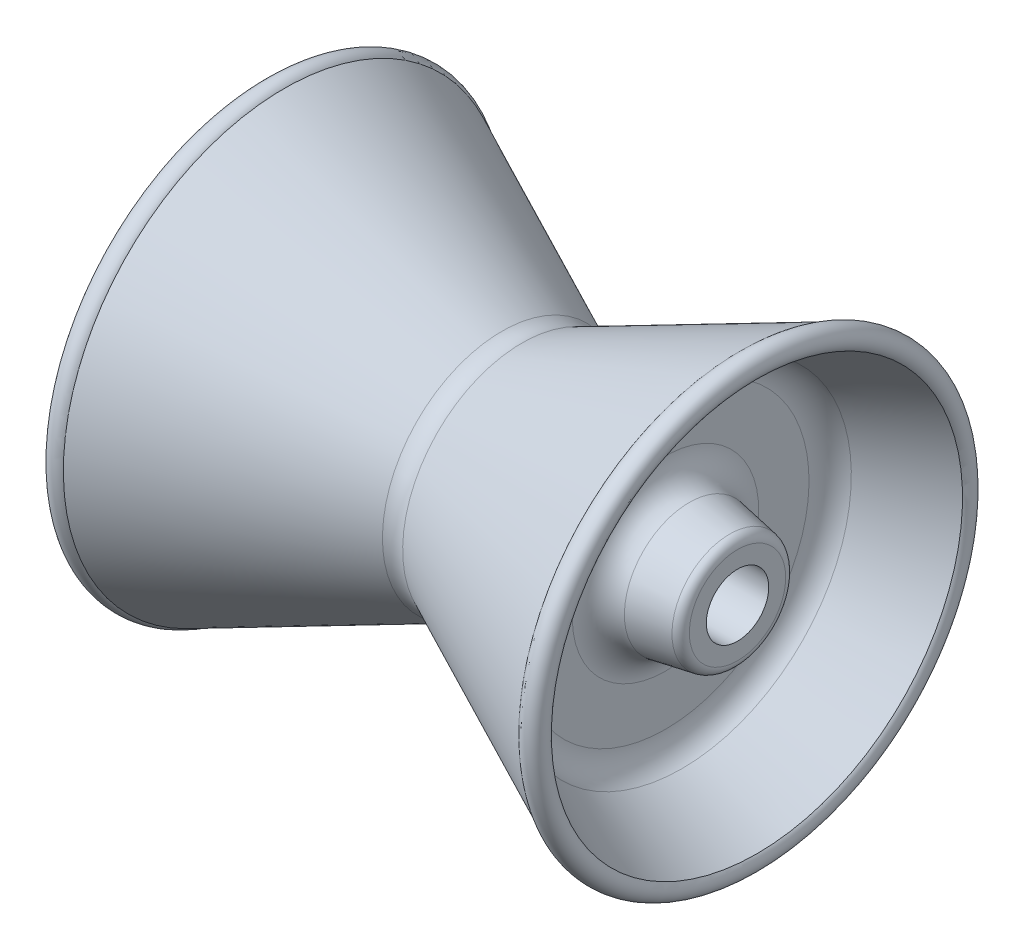
ISO-10303-21;
HEADER;
FILE_DESCRIPTION(('STEP AP214'),'2;1');
FILE_NAME('part.step','',(''),(''),'','','');
FILE_SCHEMA(('AUTOMOTIVE_DESIGN { 1 0 10303 214 1 1 1 1 }'));
ENDSEC;
DATA;
#1=APPLICATION_CONTEXT('core data for automotive mechanical design processes');
#2=APPLICATION_PROTOCOL_DEFINITION('international standard','automotive_design',2000,#1);
#3=PRODUCT_CONTEXT('',#1,'mechanical');
#4=PRODUCT('Part','Part','',(#3));
#5=PRODUCT_RELATED_PRODUCT_CATEGORY('part','',(#4));
#6=PRODUCT_DEFINITION_FORMATION('','',#4);
#7=PRODUCT_DEFINITION_CONTEXT('part definition',#1,'design');
#8=PRODUCT_DEFINITION('design','',#6,#7);
#9=PRODUCT_DEFINITION_SHAPE('','',#8);
#10=(LENGTH_UNIT() NAMED_UNIT(*) SI_UNIT(.MILLI.,.METRE.));
#11=(NAMED_UNIT(*) PLANE_ANGLE_UNIT() SI_UNIT($,.RADIAN.));
#12=(NAMED_UNIT(*) SI_UNIT($,.STERADIAN.) SOLID_ANGLE_UNIT());
#13=UNCERTAINTY_MEASURE_WITH_UNIT(LENGTH_MEASURE(1.E-05),#10,'distance_accuracy_value','');
#14=(GEOMETRIC_REPRESENTATION_CONTEXT(3) GLOBAL_UNCERTAINTY_ASSIGNED_CONTEXT((#13)) GLOBAL_UNIT_ASSIGNED_CONTEXT((#10,
#11,#12)) REPRESENTATION_CONTEXT('',''));
#15=CARTESIAN_POINT('',(0.,0.,0.));
#16=DIRECTION('',(0.,0.,1.));
#17=DIRECTION('',(1.,0.,0.));
#18=AXIS2_PLACEMENT_3D('',#15,#16,#17);
#19=CARTESIAN_POINT('',(-100.,0.,0.));
#20=DIRECTION('',(-1.,0.,0.));
#21=DIRECTION('',(0.,-1.,0.));
#22=AXIS2_PLACEMENT_3D('',#19,#20,#21);
#23=TOROIDAL_SURFACE('',#22,106.313960308022,30.);
#24=CARTESIAN_POINT('',(-87.0115930793771,0.,0.));
#25=DIRECTION('',(-1.,0.,0.));
#26=DIRECTION('',(0.,-1.,0.));
#27=AXIS2_PLACEMENT_3D('',#24,#25,#26);
#28=CIRCLE('',#27,133.356543129644);
#29=CARTESIAN_POINT('',(-87.0115930793771,-133.356543129644,0.));
#30=VERTEX_POINT('',#29);
#31=EDGE_CURVE('E10',#30,#30,#28,.T.);
#32=ORIENTED_EDGE('',*,*,#31,.F.);
#33=EDGE_LOOP('',(#32));
#34=FACE_BOUND('',#33,.T.);
#35=CARTESIAN_POINT('',(-130.,0.,0.));
#36=DIRECTION('',(-1.,0.,0.));
#37=DIRECTION('',(0.,-1.,0.));
#38=AXIS2_PLACEMENT_3D('',#35,#36,#37);
#39=CIRCLE('',#38,106.313960308022);
#40=CARTESIAN_POINT('',(-130.,-106.313960308022,0.));
#41=VERTEX_POINT('',#40);
#42=EDGE_CURVE('E123',#41,#41,#39,.T.);
#43=ORIENTED_EDGE('',*,*,#42,.T.);
#44=EDGE_LOOP('',(#43));
#45=FACE_BOUND('',#44,.T.);
#46=ADVANCED_FACE('F35',(#34,#45),#23,.F.);
#47=CARTESIAN_POINT('',(-87.0115930793771,0.,0.));
#48=DIRECTION('',(-1.,0.,0.));
#49=DIRECTION('',(0.,-1.,0.));
#50=AXIS2_PLACEMENT_3D('',#47,#48,#49);
#51=CONICAL_SURFACE('',#50,133.356543129644,0.447759394628515);
#52=CARTESIAN_POINT('',(-21.6473448677048,0.,0.));
#53=DIRECTION('',(-1.,0.,0.));
#54=DIRECTION('',(0.,-1.,0.));
#55=AXIS2_PLACEMENT_3D('',#52,#53,#54);
#56=CIRCLE('',#55,101.962446662092);
#57=CARTESIAN_POINT('',(-21.6473448677048,-101.962446662092,0.));
#58=VERTEX_POINT('',#57);
#59=EDGE_CURVE('E41',#58,#58,#56,.T.);
#60=ORIENTED_EDGE('',*,*,#59,.F.);
#61=EDGE_LOOP('',(#60));
#62=FACE_BOUND('',#61,.T.);
#63=ORIENTED_EDGE('',*,*,#31,.T.);
#64=EDGE_LOOP('',(#63));
#65=FACE_BOUND('',#64,.T.);
#66=ADVANCED_FACE('F280',(#62,#65),#51,.F.);
#67=CARTESIAN_POINT('',(0.,0.,0.));
#68=DIRECTION('',(-1.,0.,0.));
#69=DIRECTION('',(0.,-1.,0.));
#70=AXIS2_PLACEMENT_3D('',#67,#68,#69);
#71=TOROIDAL_SURFACE('',#70,147.033418031463,50.);
#72=CARTESIAN_POINT('',(21.6473448677048,0.,0.));
#73=DIRECTION('',(-1.,0.,0.));
#74=DIRECTION('',(0.,-1.,0.));
#75=AXIS2_PLACEMENT_3D('',#72,#73,#74);
#76=CIRCLE('',#75,101.962446662092);
#77=CARTESIAN_POINT('',(21.6473448677049,-101.962446662092,0.));
#78=VERTEX_POINT('',#77);
#79=EDGE_CURVE('E45',#78,#78,#76,.T.);
#80=ORIENTED_EDGE('',*,*,#79,.F.);
#81=EDGE_LOOP('',(#80));
#82=FACE_BOUND('',#81,.T.);
#83=ORIENTED_EDGE('',*,*,#59,.T.);
#84=EDGE_LOOP('',(#83));
#85=FACE_BOUND('',#84,.T.);
#86=ADVANCED_FACE('F275',(#82,#85),#71,.T.);
#87=CARTESIAN_POINT('',(21.6473448677048,0.,0.));
#88=DIRECTION('',(1.,0.,0.));
#89=DIRECTION('',(0.,1.,0.));
#90=AXIS2_PLACEMENT_3D('',#87,#88,#89);
#91=CONICAL_SURFACE('',#90,101.962446662092,0.447759394628514);
#92=CARTESIAN_POINT('',(87.0115930793771,0.,0.));
#93=DIRECTION('',(-1.,0.,0.));
#94=DIRECTION('',(0.,-1.,0.));
#95=AXIS2_PLACEMENT_3D('',#92,#93,#94);
#96=CIRCLE('',#95,133.356543129644);
#97=CARTESIAN_POINT('',(87.0115930793771,-133.356543129644,0.));
#98=VERTEX_POINT('',#97);
#99=EDGE_CURVE('E49',#98,#98,#96,.T.);
#100=ORIENTED_EDGE('',*,*,#99,.F.);
#101=EDGE_LOOP('',(#100));
#102=FACE_BOUND('',#101,.T.);
#103=ORIENTED_EDGE('',*,*,#79,.T.);
#104=EDGE_LOOP('',(#103));
#105=FACE_BOUND('',#104,.T.);
#106=ADVANCED_FACE('F269',(#102,#105),#91,.F.);
#107=CARTESIAN_POINT('',(100.,0.,0.));
#108=DIRECTION('',(-1.,0.,0.));
#109=DIRECTION('',(0.,-1.,0.));
#110=AXIS2_PLACEMENT_3D('',#107,#108,#109);
#111=TOROIDAL_SURFACE('',#110,106.313960308022,30.);
#112=CARTESIAN_POINT('',(130.,0.,0.));
#113=DIRECTION('',(-1.,0.,0.));
#114=DIRECTION('',(0.,-1.,0.));
#115=AXIS2_PLACEMENT_3D('',#112,#113,#114);
#116=CIRCLE('',#115,106.313960308022);
#117=CARTESIAN_POINT('',(130.,-106.313960308022,0.));
#118=VERTEX_POINT('',#117);
#119=EDGE_CURVE('E54',#118,#118,#116,.T.);
#120=ORIENTED_EDGE('',*,*,#119,.F.);
#121=EDGE_LOOP('',(#120));
#122=FACE_BOUND('',#121,.T.);
#123=ORIENTED_EDGE('',*,*,#99,.T.);
#124=EDGE_LOOP('',(#123));
#125=FACE_BOUND('',#124,.T.);
#126=ADVANCED_FACE('F263',(#122,#125),#111,.F.);
#127=CARTESIAN_POINT('',(130.,32.5,0.));
#128=DIRECTION('',(1.,0.,0.));
#129=DIRECTION('',(0.,1.,0.));
#130=AXIS2_PLACEMENT_3D('',#127,#128,#129);
#131=PLANE('',#130);
#132=CARTESIAN_POINT('',(130.,0.,0.));
#133=DIRECTION('',(-1.,0.,0.));
#134=DIRECTION('',(0.,-1.,0.));
#135=AXIS2_PLACEMENT_3D('',#132,#133,#134);
#136=CIRCLE('',#135,32.5);
#137=CARTESIAN_POINT('',(130.,-32.4999999999999,0.));
#138=VERTEX_POINT('',#137);
#139=EDGE_CURVE('E57',#138,#138,#136,.T.);
#140=ORIENTED_EDGE('',*,*,#139,.F.);
#141=EDGE_LOOP('',(#140));
#142=FACE_BOUND('',#141,.T.);
#143=ORIENTED_EDGE('',*,*,#119,.T.);
#144=EDGE_LOOP('',(#143));
#145=FACE_BOUND('',#144,.T.);
#146=ADVANCED_FACE('F257',(#142,#145),#131,.F.);
#147=CARTESIAN_POINT('',(-235.,0.,0.));
#148=DIRECTION('',(-1.,0.,0.));
#149=DIRECTION('',(0.,-1.,0.));
#150=AXIS2_PLACEMENT_3D('',#147,#148,#149);
#151=CYLINDRICAL_SURFACE('',#150,32.4999999999999);
#152=CARTESIAN_POINT('',(234.789217646546,0.,0.));
#153=DIRECTION('',(-1.,0.,0.));
#154=DIRECTION('',(0.,-1.,0.));
#155=AXIS2_PLACEMENT_3D('',#152,#153,#154);
#156=CIRCLE('',#155,32.4999999999999);
#157=CARTESIAN_POINT('',(234.789217646546,-32.4999999999998,0.));
#158=VERTEX_POINT('',#157);
#159=EDGE_CURVE('E60',#158,#158,#156,.T.);
#160=ORIENTED_EDGE('',*,*,#159,.F.);
#161=EDGE_LOOP('',(#160));
#162=FACE_BOUND('',#161,.T.);
#163=ORIENTED_EDGE('',*,*,#139,.T.);
#164=EDGE_LOOP('',(#163));
#165=FACE_BOUND('',#164,.T.);
#166=ADVANCED_FACE('F251',(#162,#165),#151,.F.);
#167=CARTESIAN_POINT('',(234.789217646546,32.5,0.));
#168=DIRECTION('',(-1.,0.,0.));
#169=DIRECTION('',(0.,-1.,0.));
#170=AXIS2_PLACEMENT_3D('',#167,#168,#169);
#171=PLANE('',#170);
#172=CARTESIAN_POINT('',(234.789217646546,0.,0.));
#173=DIRECTION('',(-1.,0.,0.));
#174=DIRECTION('',(0.,-1.,0.));
#175=AXIS2_PLACEMENT_3D('',#172,#173,#174);
#176=CIRCLE('',#175,50.1555273228456);
#177=CARTESIAN_POINT('',(234.789217646546,-50.1555273228456,0.));
#178=VERTEX_POINT('',#177);
#179=EDGE_CURVE('E63',#178,#178,#176,.T.);
#180=ORIENTED_EDGE('',*,*,#179,.F.);
#181=EDGE_LOOP('',(#180));
#182=FACE_BOUND('',#181,.T.);
#183=ORIENTED_EDGE('',*,*,#159,.T.);
#184=EDGE_LOOP('',(#183));
#185=FACE_BOUND('',#184,.T.);
#186=ADVANCED_FACE('F245',(#182,#185),#171,.F.);
#187=CARTESIAN_POINT('',(224.789217646546,0.,0.));
#188=DIRECTION('',(-1.,0.,0.));
#189=DIRECTION('',(0.,-1.,0.));
#190=AXIS2_PLACEMENT_3D('',#187,#188,#189);
#191=TOROIDAL_SURFACE('',#190,50.1555273228456,9.99999999999999);
#192=CARTESIAN_POINT('',(226.546020910649,0.,0.));
#193=DIRECTION('',(-1.,0.,0.));
#194=DIRECTION('',(0.,-1.,0.));
#195=AXIS2_PLACEMENT_3D('',#192,#193,#194);
#196=CIRCLE('',#195,59.9999999999999);
#197=CARTESIAN_POINT('',(226.546020910649,-59.9999999999998,0.));
#198=VERTEX_POINT('',#197);
#199=EDGE_CURVE('E66',#198,#198,#196,.T.);
#200=ORIENTED_EDGE('',*,*,#199,.F.);
#201=EDGE_LOOP('',(#200));
#202=FACE_BOUND('',#201,.T.);
#203=ORIENTED_EDGE('',*,*,#179,.T.);
#204=EDGE_LOOP('',(#203));
#205=FACE_BOUND('',#204,.T.);
#206=ADVANCED_FACE('F239',(#202,#205),#191,.T.);
#207=CARTESIAN_POINT('',(226.546020910649,0.,0.));
#208=DIRECTION('',(-1.,0.,0.));
#209=DIRECTION('',(0.,-1.,0.));
#210=AXIS2_PLACEMENT_3D('',#207,#208,#209);
#211=CONICAL_SURFACE('',#210,59.9999999999999,0.176596800117247);
#212=CARTESIAN_POINT('',(184.518807854237,0.,0.));
#213=DIRECTION('',(-1.,0.,0.));
#214=DIRECTION('',(0.,-1.,0.));
#215=AXIS2_PLACEMENT_3D('',#212,#213,#214);
#216=CIRCLE('',#215,67.4999999999999);
#217=CARTESIAN_POINT('',(184.518807854237,-67.4999999999998,0.));
#218=VERTEX_POINT('',#217);
#219=EDGE_CURVE('E69',#218,#218,#216,.T.);
#220=ORIENTED_EDGE('',*,*,#219,.F.);
#221=EDGE_LOOP('',(#220));
#222=FACE_BOUND('',#221,.T.);
#223=ORIENTED_EDGE('',*,*,#199,.T.);
#224=EDGE_LOOP('',(#223));
#225=FACE_BOUND('',#224,.T.);
#226=ADVANCED_FACE('F233',(#222,#225),#211,.T.);
#227=CARTESIAN_POINT('',(189.789217646546,0.,0.));
#228=DIRECTION('',(-1.,0.,0.));
#229=DIRECTION('',(0.,-1.,0.));
#230=AXIS2_PLACEMENT_3D('',#227,#228,#229);
#231=TOROIDAL_SURFACE('',#230,97.0334180314627,30.);
#232=CARTESIAN_POINT('',(159.789217646546,0.,0.));
#233=DIRECTION('',(-1.,0.,0.));
#234=DIRECTION('',(0.,-1.,0.));
#235=AXIS2_PLACEMENT_3D('',#232,#233,#234);
#236=CIRCLE('',#235,97.0334180314627);
#237=CARTESIAN_POINT('',(159.789217646546,-97.0334180314627,0.));
#238=VERTEX_POINT('',#237);
#239=EDGE_CURVE('E72',#238,#238,#236,.T.);
#240=ORIENTED_EDGE('',*,*,#239,.F.);
#241=EDGE_LOOP('',(#240));
#242=FACE_BOUND('',#241,.T.);
#243=ORIENTED_EDGE('',*,*,#219,.T.);
#244=EDGE_LOOP('',(#243));
#245=FACE_BOUND('',#244,.T.);
#246=ADVANCED_FACE('F227',(#242,#245),#231,.F.);
#247=CARTESIAN_POINT('',(159.789217646546,97.0334180314628,0.));
#248=DIRECTION('',(-1.,0.,0.));
#249=DIRECTION('',(0.,-1.,0.));
#250=AXIS2_PLACEMENT_3D('',#247,#248,#249);
#251=PLANE('',#250);
#252=CARTESIAN_POINT('',(159.789217646546,0.,0.));
#253=DIRECTION('',(-1.,0.,0.));
#254=DIRECTION('',(0.,-1.,0.));
#255=AXIS2_PLACEMENT_3D('',#252,#253,#254);
#256=CIRCLE('',#255,149.43923808087);
#257=CARTESIAN_POINT('',(159.789217646546,-149.439238080869,0.));
#258=VERTEX_POINT('',#257);
#259=EDGE_CURVE('E75',#258,#258,#256,.T.);
#260=ORIENTED_EDGE('',*,*,#259,.F.);
#261=EDGE_LOOP('',(#260));
#262=FACE_BOUND('',#261,.T.);
#263=ORIENTED_EDGE('',*,*,#239,.T.);
#264=EDGE_LOOP('',(#263));
#265=FACE_BOUND('',#264,.T.);
#266=ADVANCED_FACE('F221',(#262,#265),#251,.F.);
#267=CARTESIAN_POINT('',(189.789217646546,0.,0.));
#268=DIRECTION('',(-1.,0.,0.));
#269=DIRECTION('',(0.,-1.,0.));
#270=AXIS2_PLACEMENT_3D('',#267,#268,#269);
#271=TOROIDAL_SURFACE('',#270,149.43923808087,30.);
#272=CARTESIAN_POINT('',(176.800810725923,0.,0.));
#273=DIRECTION('',(-1.,0.,0.));
#274=DIRECTION('',(0.,-1.,0.));
#275=AXIS2_PLACEMENT_3D('',#272,#273,#274);
#276=CIRCLE('',#275,176.481820902492);
#277=CARTESIAN_POINT('',(176.800810725923,-176.481820902492,0.));
#278=VERTEX_POINT('',#277);
#279=EDGE_CURVE('E78',#278,#278,#276,.T.);
#280=ORIENTED_EDGE('',*,*,#279,.F.);
#281=EDGE_LOOP('',(#280));
#282=FACE_BOUND('',#281,.T.);
#283=ORIENTED_EDGE('',*,*,#259,.T.);
#284=EDGE_LOOP('',(#283));
#285=FACE_BOUND('',#284,.T.);
#286=ADVANCED_FACE('F215',(#282,#285),#271,.F.);
#287=CARTESIAN_POINT('',(176.800810725923,0.,0.));
#288=DIRECTION('',(1.,0.,0.));
#289=DIRECTION('',(0.,1.,0.));
#290=AXIS2_PLACEMENT_3D('',#287,#288,#289);
#291=CONICAL_SURFACE('',#290,176.481820902492,0.447759394628515);
#292=CARTESIAN_POINT('',(255.,0.,0.));
#293=DIRECTION('',(-1.,0.,0.));
#294=DIRECTION('',(0.,-1.,0.));
#295=AXIS2_PLACEMENT_3D('',#292,#293,#294);
#296=CIRCLE('',#295,214.040470453614);
#297=CARTESIAN_POINT('',(255.,-214.040470453614,0.));
#298=VERTEX_POINT('',#297);
#299=EDGE_CURVE('E81',#298,#298,#296,.T.);
#300=ORIENTED_EDGE('',*,*,#299,.F.);
#301=EDGE_LOOP('',(#300));
#302=FACE_BOUND('',#301,.T.);
#303=ORIENTED_EDGE('',*,*,#279,.T.);
#304=EDGE_LOOP('',(#303));
#305=FACE_BOUND('',#304,.T.);
#306=ADVANCED_FACE('F209',(#302,#305),#291,.F.);
#307=CARTESIAN_POINT('',(246.127730545789,0.,0.));
#308=DIRECTION('',(-1.,0.,0.));
#309=DIRECTION('',(0.,-1.,0.));
#310=AXIS2_PLACEMENT_3D('',#307,#308,#309);
#311=TOROIDAL_SURFACE('',#310,222.120249827574,12.);
#312=CARTESIAN_POINT('',(237.077341757446,0.,0.));
#313=DIRECTION('',(-1.,0.,0.));
#314=DIRECTION('',(0.,-1.,0.));
#315=AXIS2_PLACEMENT_3D('',#312,#313,#314);
#316=CIRCLE('',#315,230.);
#317=CARTESIAN_POINT('',(237.077341757446,-230.,0.));
#318=VERTEX_POINT('',#317);
#319=EDGE_CURVE('E84',#318,#318,#316,.T.);
#320=ORIENTED_EDGE('',*,*,#319,.F.);
#321=EDGE_LOOP('',(#320));
#322=FACE_BOUND('',#321,.T.);
#323=ORIENTED_EDGE('',*,*,#299,.T.);
#324=EDGE_LOOP('',(#323));
#325=FACE_BOUND('',#324,.T.);
#326=ADVANCED_FACE('F203',(#322,#325),#311,.T.);
#327=CARTESIAN_POINT('',(237.077341757446,0.,0.));
#328=DIRECTION('',(1.,0.,0.));
#329=DIRECTION('',(0.,1.,0.));
#330=AXIS2_PLACEMENT_3D('',#327,#328,#329);
#331=CONICAL_SURFACE('',#330,230.,0.43633231299858);
#332=CARTESIAN_POINT('',(10.5223376464579,0.,0.));
#333=DIRECTION('',(-1.,0.,0.));
#334=DIRECTION('',(0.,-1.,0.));
#335=AXIS2_PLACEMENT_3D('',#332,#333,#334);
#336=CIRCLE('',#335,124.35566658971);
#337=CARTESIAN_POINT('',(10.5223376464579,-124.35566658971,0.));
#338=VERTEX_POINT('',#337);
#339=EDGE_CURVE('E87',#338,#338,#336,.T.);
#340=ORIENTED_EDGE('',*,*,#339,.F.);
#341=EDGE_LOOP('',(#340));
#342=FACE_BOUND('',#341,.T.);
#343=ORIENTED_EDGE('',*,*,#319,.T.);
#344=EDGE_LOOP('',(#343));
#345=FACE_BOUND('',#344,.T.);
#346=ADVANCED_FACE('F197',(#342,#345),#331,.T.);
#347=CARTESIAN_POINT('',(0.,0.,0.));
#348=DIRECTION('',(-1.,0.,0.));
#349=DIRECTION('',(0.,-1.,0.));
#350=AXIS2_PLACEMENT_3D('',#347,#348,#349);
#351=TOROIDAL_SURFACE('',#350,147.033418031463,25.);
#352=CARTESIAN_POINT('',(-10.5223376464578,0.,0.));
#353=DIRECTION('',(-1.,0.,0.));
#354=DIRECTION('',(0.,-1.,0.));
#355=AXIS2_PLACEMENT_3D('',#352,#353,#354);
#356=CIRCLE('',#355,124.35566658971);
#357=CARTESIAN_POINT('',(-10.5223376464578,-124.35566658971,0.));
#358=VERTEX_POINT('',#357);
#359=EDGE_CURVE('E90',#358,#358,#356,.T.);
#360=ORIENTED_EDGE('',*,*,#359,.F.);
#361=EDGE_LOOP('',(#360));
#362=FACE_BOUND('',#361,.T.);
#363=ORIENTED_EDGE('',*,*,#339,.T.);
#364=EDGE_LOOP('',(#363));
#365=FACE_BOUND('',#364,.T.);
#366=ADVANCED_FACE('F191',(#362,#365),#351,.F.);
#367=CARTESIAN_POINT('',(-10.5223376464578,0.,0.));
#368=DIRECTION('',(-1.,0.,0.));
#369=DIRECTION('',(0.,-1.,0.));
#370=AXIS2_PLACEMENT_3D('',#367,#368,#369);
#371=CONICAL_SURFACE('',#370,124.35566658971,0.43633231299858);
#372=CARTESIAN_POINT('',(-237.077341757446,0.,0.));
#373=DIRECTION('',(-1.,0.,0.));
#374=DIRECTION('',(0.,-1.,0.));
#375=AXIS2_PLACEMENT_3D('',#372,#373,#374);
#376=CIRCLE('',#375,230.);
#377=CARTESIAN_POINT('',(-237.077341757446,-230.,0.));
#378=VERTEX_POINT('',#377);
#379=EDGE_CURVE('E93',#378,#378,#376,.T.);
#380=ORIENTED_EDGE('',*,*,#379,.F.);
#381=EDGE_LOOP('',(#380));
#382=FACE_BOUND('',#381,.T.);
#383=ORIENTED_EDGE('',*,*,#359,.T.);
#384=EDGE_LOOP('',(#383));
#385=FACE_BOUND('',#384,.T.);
#386=ADVANCED_FACE('F185',(#382,#385),#371,.T.);
#387=CARTESIAN_POINT('',(-246.127730545789,0.,0.));
#388=DIRECTION('',(-1.,0.,0.));
#389=DIRECTION('',(0.,-1.,0.));
#390=AXIS2_PLACEMENT_3D('',#387,#388,#389);
#391=TOROIDAL_SURFACE('',#390,222.120249827574,12.);
#392=CARTESIAN_POINT('',(-255.,0.,0.));
#393=DIRECTION('',(-1.,0.,0.));
#394=DIRECTION('',(0.,-1.,0.));
#395=AXIS2_PLACEMENT_3D('',#392,#393,#394);
#396=CIRCLE('',#395,214.040470453614);
#397=CARTESIAN_POINT('',(-255.,-214.040470453614,0.));
#398=VERTEX_POINT('',#397);
#399=EDGE_CURVE('E96',#398,#398,#396,.T.);
#400=ORIENTED_EDGE('',*,*,#399,.F.);
#401=EDGE_LOOP('',(#400));
#402=FACE_BOUND('',#401,.T.);
#403=ORIENTED_EDGE('',*,*,#379,.T.);
#404=EDGE_LOOP('',(#403));
#405=FACE_BOUND('',#404,.T.);
#406=ADVANCED_FACE('F179',(#402,#405),#391,.T.);
#407=CARTESIAN_POINT('',(-255.,0.,0.));
#408=DIRECTION('',(-1.,0.,0.));
#409=DIRECTION('',(0.,-1.,0.));
#410=AXIS2_PLACEMENT_3D('',#407,#408,#409);
#411=CONICAL_SURFACE('',#410,214.040470453614,0.447759394628514);
#412=CARTESIAN_POINT('',(-176.800810725923,0.,0.));
#413=DIRECTION('',(-1.,0.,0.));
#414=DIRECTION('',(0.,-1.,0.));
#415=AXIS2_PLACEMENT_3D('',#412,#413,#414);
#416=CIRCLE('',#415,176.481820902492);
#417=CARTESIAN_POINT('',(-176.800810725923,-176.481820902492,0.));
#418=VERTEX_POINT('',#417);
#419=EDGE_CURVE('E99',#418,#418,#416,.T.);
#420=ORIENTED_EDGE('',*,*,#419,.F.);
#421=EDGE_LOOP('',(#420));
#422=FACE_BOUND('',#421,.T.);
#423=ORIENTED_EDGE('',*,*,#399,.T.);
#424=EDGE_LOOP('',(#423));
#425=FACE_BOUND('',#424,.T.);
#426=ADVANCED_FACE('F173',(#422,#425),#411,.F.);
#427=CARTESIAN_POINT('',(-189.789217646546,0.,0.));
#428=DIRECTION('',(-1.,0.,0.));
#429=DIRECTION('',(0.,-1.,0.));
#430=AXIS2_PLACEMENT_3D('',#427,#428,#429);
#431=TOROIDAL_SURFACE('',#430,149.43923808087,30.);
#432=CARTESIAN_POINT('',(-159.789217646546,0.,0.));
#433=DIRECTION('',(-1.,0.,0.));
#434=DIRECTION('',(0.,-1.,0.));
#435=AXIS2_PLACEMENT_3D('',#432,#433,#434);
#436=CIRCLE('',#435,149.43923808087);
#437=CARTESIAN_POINT('',(-159.789217646546,-149.43923808087,0.));
#438=VERTEX_POINT('',#437);
#439=EDGE_CURVE('E102',#438,#438,#436,.T.);
#440=ORIENTED_EDGE('',*,*,#439,.F.);
#441=EDGE_LOOP('',(#440));
#442=FACE_BOUND('',#441,.T.);
#443=ORIENTED_EDGE('',*,*,#419,.T.);
#444=EDGE_LOOP('',(#443));
#445=FACE_BOUND('',#444,.T.);
#446=ADVANCED_FACE('F167',(#442,#445),#431,.F.);
#447=CARTESIAN_POINT('',(-159.789217646546,97.0334180314628,0.));
#448=DIRECTION('',(1.,0.,0.));
#449=DIRECTION('',(0.,1.,0.));
#450=AXIS2_PLACEMENT_3D('',#447,#448,#449);
#451=PLANE('',#450);
#452=CARTESIAN_POINT('',(-159.789217646546,0.,0.));
#453=DIRECTION('',(-1.,0.,0.));
#454=DIRECTION('',(0.,-1.,0.));
#455=AXIS2_PLACEMENT_3D('',#452,#453,#454);
#456=CIRCLE('',#455,97.0334180314628);
#457=CARTESIAN_POINT('',(-159.789217646546,-97.0334180314628,0.));
#458=VERTEX_POINT('',#457);
#459=EDGE_CURVE('E105',#458,#458,#456,.T.);
#460=ORIENTED_EDGE('',*,*,#459,.F.);
#461=EDGE_LOOP('',(#460));
#462=FACE_BOUND('',#461,.T.);
#463=ORIENTED_EDGE('',*,*,#439,.T.);
#464=EDGE_LOOP('',(#463));
#465=FACE_BOUND('',#464,.T.);
#466=ADVANCED_FACE('F161',(#462,#465),#451,.F.);
#467=CARTESIAN_POINT('',(-189.789217646546,0.,0.));
#468=DIRECTION('',(-1.,0.,0.));
#469=DIRECTION('',(0.,-1.,0.));
#470=AXIS2_PLACEMENT_3D('',#467,#468,#469);
#471=TOROIDAL_SURFACE('',#470,97.0334180314628,30.);
#472=CARTESIAN_POINT('',(-184.518807854237,0.,0.));
#473=DIRECTION('',(-1.,0.,0.));
#474=DIRECTION('',(0.,-1.,0.));
#475=AXIS2_PLACEMENT_3D('',#472,#473,#474);
#476=CIRCLE('',#475,67.5);
#477=CARTESIAN_POINT('',(-184.518807854237,-67.5,0.));
#478=VERTEX_POINT('',#477);
#479=EDGE_CURVE('E108',#478,#478,#476,.T.);
#480=ORIENTED_EDGE('',*,*,#479,.F.);
#481=EDGE_LOOP('',(#480));
#482=FACE_BOUND('',#481,.T.);
#483=ORIENTED_EDGE('',*,*,#459,.T.);
#484=EDGE_LOOP('',(#483));
#485=FACE_BOUND('',#484,.T.);
#486=ADVANCED_FACE('F155',(#482,#485),#471,.F.);
#487=CARTESIAN_POINT('',(-184.518807854237,0.,0.));
#488=DIRECTION('',(1.,0.,0.));
#489=DIRECTION('',(0.,1.,0.));
#490=AXIS2_PLACEMENT_3D('',#487,#488,#489);
#491=CONICAL_SURFACE('',#490,67.5,0.176596800117246);
#492=CARTESIAN_POINT('',(-226.546020910649,0.,0.));
#493=DIRECTION('',(-1.,0.,0.));
#494=DIRECTION('',(0.,-1.,0.));
#495=AXIS2_PLACEMENT_3D('',#492,#493,#494);
#496=CIRCLE('',#495,60.);
#497=CARTESIAN_POINT('',(-226.546020910649,-60.,0.));
#498=VERTEX_POINT('',#497);
#499=EDGE_CURVE('E111',#498,#498,#496,.T.);
#500=ORIENTED_EDGE('',*,*,#499,.F.);
#501=EDGE_LOOP('',(#500));
#502=FACE_BOUND('',#501,.T.);
#503=ORIENTED_EDGE('',*,*,#479,.T.);
#504=EDGE_LOOP('',(#503));
#505=FACE_BOUND('',#504,.T.);
#506=ADVANCED_FACE('F149',(#502,#505),#491,.T.);
#507=CARTESIAN_POINT('',(-224.789217646546,0.,0.));
#508=DIRECTION('',(-1.,0.,0.));
#509=DIRECTION('',(0.,-1.,0.));
#510=AXIS2_PLACEMENT_3D('',#507,#508,#509);
#511=TOROIDAL_SURFACE('',#510,50.1555273228457,9.99999999999999);
#512=CARTESIAN_POINT('',(-234.789217646546,0.,0.));
#513=DIRECTION('',(-1.,0.,0.));
#514=DIRECTION('',(0.,-1.,0.));
#515=AXIS2_PLACEMENT_3D('',#512,#513,#514);
#516=CIRCLE('',#515,50.1555273228457);
#517=CARTESIAN_POINT('',(-234.789217646546,-50.1555273228457,0.));
#518=VERTEX_POINT('',#517);
#519=EDGE_CURVE('E114',#518,#518,#516,.T.);
#520=ORIENTED_EDGE('',*,*,#519,.F.);
#521=EDGE_LOOP('',(#520));
#522=FACE_BOUND('',#521,.T.);
#523=ORIENTED_EDGE('',*,*,#499,.T.);
#524=EDGE_LOOP('',(#523));
#525=FACE_BOUND('',#524,.T.);
#526=ADVANCED_FACE('F143',(#522,#525),#511,.T.);
#527=CARTESIAN_POINT('',(-234.789217646546,32.5,0.));
#528=DIRECTION('',(1.,0.,0.));
#529=DIRECTION('',(0.,1.,0.));
#530=AXIS2_PLACEMENT_3D('',#527,#528,#529);
#531=PLANE('',#530);
#532=CARTESIAN_POINT('',(-234.789217646546,0.,0.));
#533=DIRECTION('',(-1.,0.,0.));
#534=DIRECTION('',(0.,-1.,0.));
#535=AXIS2_PLACEMENT_3D('',#532,#533,#534);
#536=CIRCLE('',#535,32.5);
#537=CARTESIAN_POINT('',(-234.789217646546,-32.5,0.));
#538=VERTEX_POINT('',#537);
#539=EDGE_CURVE('E117',#538,#538,#536,.T.);
#540=ORIENTED_EDGE('',*,*,#539,.F.);
#541=EDGE_LOOP('',(#540));
#542=FACE_BOUND('',#541,.T.);
#543=ORIENTED_EDGE('',*,*,#519,.T.);
#544=EDGE_LOOP('',(#543));
#545=FACE_BOUND('',#544,.T.);
#546=ADVANCED_FACE('F137',(#542,#545),#531,.F.);
#547=CARTESIAN_POINT('',(-235.,0.,0.));
#548=DIRECTION('',(-1.,0.,0.));
#549=DIRECTION('',(0.,-1.,0.));
#550=AXIS2_PLACEMENT_3D('',#547,#548,#549);
#551=CYLINDRICAL_SURFACE('',#550,32.5);
#552=CARTESIAN_POINT('',(-130.,0.,0.));
#553=DIRECTION('',(-1.,0.,0.));
#554=DIRECTION('',(0.,-1.,0.));
#555=AXIS2_PLACEMENT_3D('',#552,#553,#554);
#556=CIRCLE('',#555,32.5);
#557=CARTESIAN_POINT('',(-130.,-32.5,0.));
#558=VERTEX_POINT('',#557);
#559=EDGE_CURVE('E120',#558,#558,#556,.T.);
#560=ORIENTED_EDGE('',*,*,#559,.F.);
#561=EDGE_LOOP('',(#560));
#562=FACE_BOUND('',#561,.T.);
#563=ORIENTED_EDGE('',*,*,#539,.T.);
#564=EDGE_LOOP('',(#563));
#565=FACE_BOUND('',#564,.T.);
#566=ADVANCED_FACE('F131',(#562,#565),#551,.F.);
#567=CARTESIAN_POINT('',(-130.,32.5,0.));
#568=DIRECTION('',(-1.,0.,0.));
#569=DIRECTION('',(0.,-1.,0.));
#570=AXIS2_PLACEMENT_3D('',#567,#568,#569);
#571=PLANE('',#570);
#572=ORIENTED_EDGE('',*,*,#42,.F.);
#573=EDGE_LOOP('',(#572));
#574=FACE_BOUND('',#573,.T.);
#575=ORIENTED_EDGE('',*,*,#559,.T.);
#576=EDGE_LOOP('',(#575));
#577=FACE_BOUND('',#576,.T.);
#578=ADVANCED_FACE('F128',(#574,#577),#571,.F.);
#579=CLOSED_SHELL('',(#46,#66,#86,#106,#126,#146,#166,#186,#206,#226,#246,#266,#286,#306,#326,
#346,#366,#386,#406,#426,#446,#466,#486,#506,#526,#546,#566,#578));
#580=MANIFOLD_SOLID_BREP('B2',#579);
#581=ADVANCED_BREP_SHAPE_REPRESENTATION('',(#18,#580),#14);
#582=SHAPE_DEFINITION_REPRESENTATION(#9,#581);
ENDSEC;
END-ISO-10303-21;
